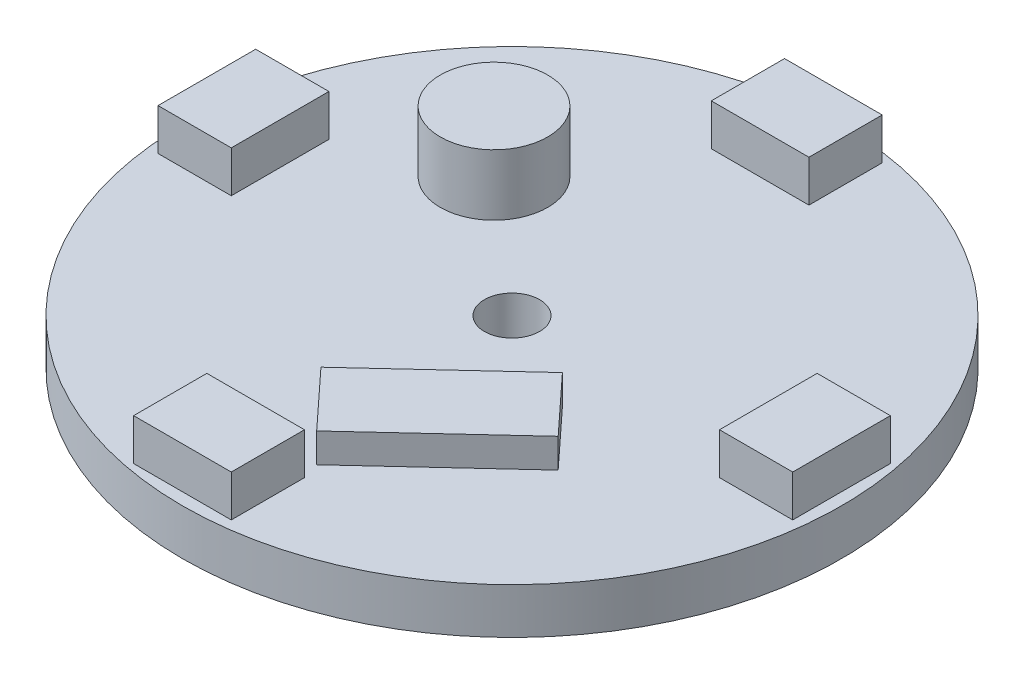
ISO-10303-21;
HEADER;
FILE_DESCRIPTION(('STEP AP214'),'2;1');
FILE_NAME('part.step','',(''),(''),'','','');
FILE_SCHEMA(('AUTOMOTIVE_DESIGN { 1 0 10303 214 1 1 1 1 }'));
ENDSEC;
DATA;
#1=APPLICATION_CONTEXT('core data for automotive mechanical design processes');
#2=APPLICATION_PROTOCOL_DEFINITION('international standard','automotive_design',2000,#1);
#3=PRODUCT_CONTEXT('',#1,'mechanical');
#4=PRODUCT('Part','Part','',(#3));
#5=PRODUCT_RELATED_PRODUCT_CATEGORY('part','',(#4));
#6=PRODUCT_DEFINITION_FORMATION('','',#4);
#7=PRODUCT_DEFINITION_CONTEXT('part definition',#1,'design');
#8=PRODUCT_DEFINITION('design','',#6,#7);
#9=PRODUCT_DEFINITION_SHAPE('','',#8);
#10=(LENGTH_UNIT() NAMED_UNIT(*) SI_UNIT(.MILLI.,.METRE.));
#11=(NAMED_UNIT(*) PLANE_ANGLE_UNIT() SI_UNIT($,.RADIAN.));
#12=(NAMED_UNIT(*) SI_UNIT($,.STERADIAN.) SOLID_ANGLE_UNIT());
#13=UNCERTAINTY_MEASURE_WITH_UNIT(LENGTH_MEASURE(1.E-05),#10,'distance_accuracy_value','');
#14=(GEOMETRIC_REPRESENTATION_CONTEXT(3) GLOBAL_UNCERTAINTY_ASSIGNED_CONTEXT((#13)) GLOBAL_UNIT_ASSIGNED_CONTEXT((#10,
#11,#12)) REPRESENTATION_CONTEXT('',''));
#15=CARTESIAN_POINT('',(0.,0.,0.));
#16=DIRECTION('',(0.,0.,1.));
#17=DIRECTION('',(1.,0.,0.));
#18=AXIS2_PLACEMENT_3D('',#15,#16,#17);
#19=CARTESIAN_POINT('',(-9.27087677780492,2.38125,-8.81791286479938));
#20=DIRECTION('',(0.,1.,0.));
#21=DIRECTION('',(0.,0.,1.));
#22=AXIS2_PLACEMENT_3D('',#19,#20,#21);
#23=PLANE('',#22);
#24=DIRECTION('',(1.,0.,0.));
#25=VECTOR('',#24,1.);
#26=CARTESIAN_POINT('',(-25.7808767778049,2.38125,-6.91291286479939));
#27=LINE('',#26,#25);
#28=CARTESIAN_POINT('',(-25.7808767778049,2.38125,-6.91291286479939));
#29=VERTEX_POINT('',#28);
#30=CARTESIAN_POINT('',(-21.9708767778049,2.38125,-6.91291286479939));
#31=VERTEX_POINT('',#30);
#32=EDGE_CURVE('E200',#29,#31,#27,.T.);
#33=ORIENTED_EDGE('',*,*,#32,.F.);
#34=DIRECTION('',(0.,0.,1.));
#35=VECTOR('',#34,1.);
#36=CARTESIAN_POINT('',(-25.7808767778049,2.38125,-11.9929128647994));
#37=LINE('',#36,#35);
#38=CARTESIAN_POINT('',(-25.7808767778049,2.38125,-11.9929128647994));
#39=VERTEX_POINT('',#38);
#40=EDGE_CURVE('E197',#39,#29,#37,.T.);
#41=ORIENTED_EDGE('',*,*,#40,.F.);
#42=DIRECTION('',(-1.,0.,0.));
#43=VECTOR('',#42,1.);
#44=CARTESIAN_POINT('',(-25.7808767778049,2.38125,-11.9929128647994));
#45=LINE('',#44,#43);
#46=CARTESIAN_POINT('',(-21.9708767778049,2.38125,-11.9929128647994));
#47=VERTEX_POINT('',#46);
#48=EDGE_CURVE('E209',#47,#39,#45,.T.);
#49=ORIENTED_EDGE('',*,*,#48,.F.);
#50=DIRECTION('',(0.,0.,-1.));
#51=VECTOR('',#50,1.);
#52=CARTESIAN_POINT('',(-21.9708767778049,2.38125,-11.9929128647994));
#53=LINE('',#52,#51);
#54=EDGE_CURVE('E217',#31,#47,#53,.T.);
#55=ORIENTED_EDGE('',*,*,#54,.F.);
#56=EDGE_LOOP('',(#33,#41,#49,#55));
#57=FACE_BOUND('',#56,.T.);
#58=DIRECTION('',(1.,0.,0.));
#59=VECTOR('',#58,1.);
#60=CARTESIAN_POINT('',(-11.6027994805209,2.38125,-21.5179128647994));
#61=LINE('',#60,#59);
#62=CARTESIAN_POINT('',(-11.6027994805209,2.38125,-21.5179128647994));
#63=VERTEX_POINT('',#62);
#64=CARTESIAN_POINT('',(-6.52279948052094,2.38125,-21.5179128647994));
#65=VERTEX_POINT('',#64);
#66=EDGE_CURVE('E271',#63,#65,#61,.T.);
#67=ORIENTED_EDGE('',*,*,#66,.F.);
#68=DIRECTION('',(0.,0.,1.));
#69=VECTOR('',#68,1.);
#70=CARTESIAN_POINT('',(-11.6027994805209,2.38125,-25.3279128647994));
#71=LINE('',#70,#69);
#72=CARTESIAN_POINT('',(-11.6027994805209,2.38125,-25.3279128647994));
#73=VERTEX_POINT('',#72);
#74=EDGE_CURVE('E257',#73,#63,#71,.T.);
#75=ORIENTED_EDGE('',*,*,#74,.F.);
#76=DIRECTION('',(-1.,0.,0.));
#77=VECTOR('',#76,1.);
#78=CARTESIAN_POINT('',(-11.6027994805209,2.38125,-25.3279128647994));
#79=LINE('',#78,#77);
#80=CARTESIAN_POINT('',(-6.52279948052094,2.38125,-25.3279128647994));
#81=VERTEX_POINT('',#80);
#82=EDGE_CURVE('E262',#81,#73,#79,.T.);
#83=ORIENTED_EDGE('',*,*,#82,.F.);
#84=DIRECTION('',(0.,0.,-1.));
#85=VECTOR('',#84,1.);
#86=CARTESIAN_POINT('',(-6.52279948052094,2.38125,-25.3279128647994));
#87=LINE('',#86,#85);
#88=EDGE_CURVE('E273',#65,#81,#87,.T.);
#89=ORIENTED_EDGE('',*,*,#88,.F.);
#90=EDGE_LOOP('',(#67,#75,#83,#89));
#91=FACE_BOUND('',#90,.T.);
#92=CARTESIAN_POINT('',(-16.0076279635767,2.38125,-14.6186269123113));
#93=DIRECTION('',(0.,1.,0.));
#94=DIRECTION('',(0.,0.,1.));
#95=AXIS2_PLACEMENT_3D('',#92,#93,#94);
#96=CIRCLE('',#95,2.794);
#97=CARTESIAN_POINT('',(-16.0076279635767,2.38125,-11.8246269123113));
#98=VERTEX_POINT('',#97);
#99=EDGE_CURVE('E314',#98,#98,#96,.T.);
#100=ORIENTED_EDGE('',*,*,#99,.F.);
#101=EDGE_LOOP('',(#100));
#102=FACE_BOUND('',#101,.T.);
#103=CARTESIAN_POINT('',(-9.27087677780492,2.38125,-8.81791286479938));
#104=DIRECTION('',(0.,1.,0.));
#105=DIRECTION('',(0.,0.,1.));
#106=AXIS2_PLACEMENT_3D('',#103,#104,#105);
#107=CIRCLE('',#106,17.145);
#108=CARTESIAN_POINT('',(-9.27087677780492,2.38125,-25.9629128647994));
#109=VERTEX_POINT('',#108);
#110=EDGE_CURVE('E11',#109,#109,#107,.T.);
#111=ORIENTED_EDGE('',*,*,#110,.T.);
#112=EDGE_LOOP('',(#111));
#113=FACE_BOUND('',#112,.T.);
#114=CARTESIAN_POINT('',(-9.27087677780492,2.38125,-8.81791286479938));
#115=DIRECTION('',(0.,1.,0.));
#116=DIRECTION('',(0.,0.,1.));
#117=AXIS2_PLACEMENT_3D('',#114,#115,#116);
#118=CIRCLE('',#117,1.43622908399752);
#119=CARTESIAN_POINT('',(-9.27087677780492,2.38125,-10.2541419487969));
#120=VERTEX_POINT('',#119);
#121=EDGE_CURVE('E321',#120,#120,#118,.T.);
#122=ORIENTED_EDGE('',*,*,#121,.F.);
#123=EDGE_LOOP('',(#122));
#124=FACE_BOUND('',#123,.T.);
#125=DIRECTION('',(0.733904866705104,0.,-0.679252270240272));
#126=VECTOR('',#125,1.);
#127=CARTESIAN_POINT('',(-1.10671318531109,2.38125,-3.05480252081948));
#128=LINE('',#127,#126);
#129=CARTESIAN_POINT('',(-7.63112745031947,2.38125,2.98375016161654));
#130=VERTEX_POINT('',#129);
#131=CARTESIAN_POINT('',(-1.10671318531109,2.38125,-3.05480252081948));
#132=VERTEX_POINT('',#131);
#133=EDGE_CURVE('E298',#130,#132,#128,.T.);
#134=ORIENTED_EDGE('',*,*,#133,.F.);
#135=DIRECTION('',(0.679252270240272,0.,0.733904866705104));
#136=VECTOR('',#135,1.);
#137=CARTESIAN_POINT('',(-7.63112745031947,2.38125,2.98375016161654));
#138=LINE('',#137,#136);
#139=CARTESIAN_POINT('',(-10.3916086765759,2.38125,0.0011607833269936));
#140=VERTEX_POINT('',#139);
#141=EDGE_CURVE('E286',#140,#130,#138,.T.);
#142=ORIENTED_EDGE('',*,*,#141,.F.);
#143=DIRECTION('',(-0.733904866705104,0.,0.679252270240272));
#144=VECTOR('',#143,1.);
#145=CARTESIAN_POINT('',(-10.3916086765759,2.38125,0.0011607833269936));
#146=LINE('',#145,#144);
#147=CARTESIAN_POINT('',(-3.86719441156756,2.38125,-6.03739189910903));
#148=VERTEX_POINT('',#147);
#149=EDGE_CURVE('E290',#148,#140,#146,.T.);
#150=ORIENTED_EDGE('',*,*,#149,.F.);
#151=DIRECTION('',(-0.679252270240272,0.,-0.733904866705104));
#152=VECTOR('',#151,1.);
#153=CARTESIAN_POINT('',(-3.86719441156756,2.38125,-6.03739189910903));
#154=LINE('',#153,#152);
#155=EDGE_CURVE('E300',#132,#148,#154,.T.);
#156=ORIENTED_EDGE('',*,*,#155,.F.);
#157=EDGE_LOOP('',(#134,#142,#150,#156));
#158=FACE_BOUND('',#157,.T.);
#159=DIRECTION('',(1.,0.,0.));
#160=VECTOR('',#159,1.);
#161=CARTESIAN_POINT('',(-12.4458767778049,2.38125,7.69208713520061));
#162=LINE('',#161,#160);
#163=CARTESIAN_POINT('',(-12.4458767778049,2.38125,7.69208713520061));
#164=VERTEX_POINT('',#163);
#165=CARTESIAN_POINT('',(-7.36587677780491,2.38125,7.69208713520061));
#166=VERTEX_POINT('',#165);
#167=EDGE_CURVE('E242',#164,#166,#162,.T.);
#168=ORIENTED_EDGE('',*,*,#167,.F.);
#169=DIRECTION('',(0.,0.,1.));
#170=VECTOR('',#169,1.);
#171=CARTESIAN_POINT('',(-12.4458767778049,2.38125,3.88208713520062));
#172=LINE('',#171,#170);
#173=CARTESIAN_POINT('',(-12.4458767778049,2.38125,3.88208713520062));
#174=VERTEX_POINT('',#173);
#175=EDGE_CURVE('E228',#174,#164,#172,.T.);
#176=ORIENTED_EDGE('',*,*,#175,.F.);
#177=DIRECTION('',(-1.,0.,0.));
#178=VECTOR('',#177,1.);
#179=CARTESIAN_POINT('',(-12.4458767778049,2.38125,3.88208713520062));
#180=LINE('',#179,#178);
#181=CARTESIAN_POINT('',(-7.36587677780491,2.38125,3.88208713520062));
#182=VERTEX_POINT('',#181);
#183=EDGE_CURVE('E233',#182,#174,#180,.T.);
#184=ORIENTED_EDGE('',*,*,#183,.F.);
#185=DIRECTION('',(0.,0.,-1.));
#186=VECTOR('',#185,1.);
#187=CARTESIAN_POINT('',(-7.36587677780491,2.38125,3.88208713520062));
#188=LINE('',#187,#186);
#189=EDGE_CURVE('E244',#166,#182,#188,.T.);
#190=ORIENTED_EDGE('',*,*,#189,.F.);
#191=EDGE_LOOP('',(#168,#176,#184,#190));
#192=FACE_BOUND('',#191,.T.);
#193=DIRECTION('',(1.,0.,0.));
#194=VECTOR('',#193,1.);
#195=CARTESIAN_POINT('',(3.42912322219508,2.38125,-6.91291286479938));
#196=LINE('',#195,#194);
#197=CARTESIAN_POINT('',(3.42912322219508,2.38125,-6.91291286479938));
#198=VERTEX_POINT('',#197);
#199=CARTESIAN_POINT('',(7.23912322219508,2.38125,-6.91291286479938));
#200=VERTEX_POINT('',#199);
#201=EDGE_CURVE('E372',#198,#200,#196,.T.);
#202=ORIENTED_EDGE('',*,*,#201,.F.);
#203=DIRECTION('',(0.,0.,1.));
#204=VECTOR('',#203,1.);
#205=CARTESIAN_POINT('',(3.42912322219508,2.38125,-11.9929128647994));
#206=LINE('',#205,#204);
#207=CARTESIAN_POINT('',(3.42912322219508,2.38125,-11.9929128647994));
#208=VERTEX_POINT('',#207);
#209=EDGE_CURVE('E195',#208,#198,#206,.T.);
#210=ORIENTED_EDGE('',*,*,#209,.F.);
#211=DIRECTION('',(-1.,0.,0.));
#212=VECTOR('',#211,1.);
#213=CARTESIAN_POINT('',(3.42912322219508,2.38125,-11.9929128647994));
#214=LINE('',#213,#212);
#215=CARTESIAN_POINT('',(7.23912322219507,2.38125,-11.9929128647994));
#216=VERTEX_POINT('',#215);
#217=EDGE_CURVE('E191',#216,#208,#214,.T.);
#218=ORIENTED_EDGE('',*,*,#217,.F.);
#219=DIRECTION('',(0.,0.,-1.));
#220=VECTOR('',#219,1.);
#221=CARTESIAN_POINT('',(7.23912322219508,2.38125,-11.9929128647994));
#222=LINE('',#221,#220);
#223=EDGE_CURVE('E374',#200,#216,#222,.T.);
#224=ORIENTED_EDGE('',*,*,#223,.F.);
#225=EDGE_LOOP('',(#202,#210,#218,#224));
#226=FACE_BOUND('',#225,.T.);
#227=ADVANCED_FACE('F34',(#57,#91,#102,#113,#124,#158,#192,#226),#23,.T.);
#228=CARTESIAN_POINT('',(-9.27087677780492,0.,-8.81791286479938));
#229=DIRECTION('',(0.,1.,0.));
#230=DIRECTION('',(0.,0.,1.));
#231=AXIS2_PLACEMENT_3D('',#228,#229,#230);
#232=PLANE('',#231);
#233=CARTESIAN_POINT('',(-9.27087677780492,0.,-8.81791286479938));
#234=DIRECTION('',(0.,1.,0.));
#235=DIRECTION('',(0.,0.,1.));
#236=AXIS2_PLACEMENT_3D('',#233,#234,#235);
#237=CIRCLE('',#236,17.145);
#238=CARTESIAN_POINT('',(-9.27087677780492,0.,-25.9629128647994));
#239=VERTEX_POINT('',#238);
#240=EDGE_CURVE('E38',#239,#239,#237,.T.);
#241=ORIENTED_EDGE('',*,*,#240,.F.);
#242=EDGE_LOOP('',(#241));
#243=FACE_BOUND('',#242,.T.);
#244=CARTESIAN_POINT('',(-9.27087677780492,0.,-8.81791286479938));
#245=DIRECTION('',(0.,1.,0.));
#246=DIRECTION('',(0.,0.,1.));
#247=AXIS2_PLACEMENT_3D('',#244,#245,#246);
#248=CIRCLE('',#247,1.43622908399752);
#249=CARTESIAN_POINT('',(-9.27087677780492,0.,-10.2541419487969));
#250=VERTEX_POINT('',#249);
#251=EDGE_CURVE('E318',#250,#250,#248,.T.);
#252=ORIENTED_EDGE('',*,*,#251,.T.);
#253=EDGE_LOOP('',(#252));
#254=FACE_BOUND('',#253,.T.);
#255=ADVANCED_FACE('F327',(#243,#254),#232,.F.);
#256=CARTESIAN_POINT('',(-9.27087677780492,2.38125,-8.81791286479938));
#257=DIRECTION('',(0.,-1.,0.));
#258=DIRECTION('',(0.,0.,-1.));
#259=AXIS2_PLACEMENT_3D('',#256,#257,#258);
#260=CYLINDRICAL_SURFACE('',#259,17.145);
#261=CARTESIAN_POINT('',(-9.27087677780492,2.38125,-25.9629128647994));
#262=CARTESIAN_POINT('',(-9.27087677780492,2.3564453125,-25.9629128647994));
#263=CARTESIAN_POINT('',(-9.27087677780492,2.331640625,-25.9629128647994));
#264=CARTESIAN_POINT('',(-9.27087677780492,2.28203125,-25.9629128647994));
#265=CARTESIAN_POINT('',(-9.27087677780492,2.2572265625,-25.9629128647994));
#266=CARTESIAN_POINT('',(-9.27087677780492,2.2076171875,-25.9629128647994));
#267=CARTESIAN_POINT('',(-9.27087677780492,2.1828125,-25.9629128647994));
#268=CARTESIAN_POINT('',(-9.27087677780492,2.133203125,-25.9629128647994));
#269=CARTESIAN_POINT('',(-9.27087677780492,2.1083984375,-25.9629128647994));
#270=CARTESIAN_POINT('',(-9.27087677780492,2.0587890625,-25.9629128647994));
#271=CARTESIAN_POINT('',(-9.27087677780492,2.033984375,-25.9629128647994));
#272=CARTESIAN_POINT('',(-9.27087677780492,1.984375,-25.9629128647994));
#273=CARTESIAN_POINT('',(-9.27087677780492,1.9595703125,-25.9629128647994));
#274=CARTESIAN_POINT('',(-9.27087677780492,1.9099609375,-25.9629128647994));
#275=CARTESIAN_POINT('',(-9.27087677780492,1.88515625,-25.9629128647994));
#276=CARTESIAN_POINT('',(-9.27087677780492,1.835546875,-25.9629128647994));
#277=CARTESIAN_POINT('',(-9.27087677780492,1.8107421875,-25.9629128647994));
#278=CARTESIAN_POINT('',(-9.27087677780492,1.7611328125,-25.9629128647994));
#279=CARTESIAN_POINT('',(-9.27087677780492,1.736328125,-25.9629128647994));
#280=CARTESIAN_POINT('',(-9.27087677780492,1.68671875,-25.9629128647994));
#281=CARTESIAN_POINT('',(-9.27087677780492,1.6619140625,-25.9629128647994));
#282=CARTESIAN_POINT('',(-9.27087677780492,1.6123046875,-25.9629128647994));
#283=CARTESIAN_POINT('',(-9.27087677780492,1.5875,-25.9629128647994));
#284=CARTESIAN_POINT('',(-9.27087677780492,1.537890625,-25.9629128647994));
#285=CARTESIAN_POINT('',(-9.27087677780492,1.5130859375,-25.9629128647994));
#286=CARTESIAN_POINT('',(-9.27087677780492,1.4634765625,-25.9629128647994));
#287=CARTESIAN_POINT('',(-9.27087677780492,1.438671875,-25.9629128647994));
#288=CARTESIAN_POINT('',(-9.27087677780492,1.3890625,-25.9629128647994));
#289=CARTESIAN_POINT('',(-9.27087677780492,1.3642578125,-25.9629128647994));
#290=CARTESIAN_POINT('',(-9.27087677780492,1.3146484375,-25.9629128647994));
#291=CARTESIAN_POINT('',(-9.27087677780492,1.28984375,-25.9629128647994));
#292=CARTESIAN_POINT('',(-9.27087677780492,1.240234375,-25.9629128647994));
#293=CARTESIAN_POINT('',(-9.27087677780492,1.2154296875,-25.9629128647994));
#294=CARTESIAN_POINT('',(-9.27087677780492,1.1658203125,-25.9629128647994));
#295=CARTESIAN_POINT('',(-9.27087677780492,1.141015625,-25.9629128647994));
#296=CARTESIAN_POINT('',(-9.27087677780492,1.09140625,-25.9629128647994));
#297=CARTESIAN_POINT('',(-9.27087677780492,1.0666015625,-25.9629128647994));
#298=CARTESIAN_POINT('',(-9.27087677780492,1.0169921875,-25.9629128647994));
#299=CARTESIAN_POINT('',(-9.27087677780492,0.9921875,-25.9629128647994));
#300=CARTESIAN_POINT('',(-9.27087677780492,0.942578125,-25.9629128647994));
#301=CARTESIAN_POINT('',(-9.27087677780492,0.9177734375,-25.9629128647994));
#302=CARTESIAN_POINT('',(-9.27087677780492,0.8681640625,-25.9629128647994));
#303=CARTESIAN_POINT('',(-9.27087677780492,0.843359375,-25.9629128647994));
#304=CARTESIAN_POINT('',(-9.27087677780492,0.79375,-25.9629128647994));
#305=CARTESIAN_POINT('',(-9.27087677780492,0.7689453125,-25.9629128647994));
#306=CARTESIAN_POINT('',(-9.27087677780492,0.7193359375,-25.9629128647994));
#307=CARTESIAN_POINT('',(-9.27087677780492,0.69453125,-25.9629128647994));
#308=CARTESIAN_POINT('',(-9.27087677780492,0.644921875,-25.9629128647994));
#309=CARTESIAN_POINT('',(-9.27087677780492,0.6201171875,-25.9629128647994));
#310=CARTESIAN_POINT('',(-9.27087677780492,0.5705078125,-25.9629128647994));
#311=CARTESIAN_POINT('',(-9.27087677780492,0.545703125,-25.9629128647994));
#312=CARTESIAN_POINT('',(-9.27087677780492,0.49609375,-25.9629128647994));
#313=CARTESIAN_POINT('',(-9.27087677780492,0.4712890625,-25.9629128647994));
#314=CARTESIAN_POINT('',(-9.27087677780492,0.4216796875,-25.9629128647994));
#315=CARTESIAN_POINT('',(-9.27087677780492,0.396875,-25.9629128647994));
#316=CARTESIAN_POINT('',(-9.27087677780492,0.347265625,-25.9629128647994));
#317=CARTESIAN_POINT('',(-9.27087677780492,0.3224609375,-25.9629128647994));
#318=CARTESIAN_POINT('',(-9.27087677780492,0.2728515625,-25.9629128647994));
#319=CARTESIAN_POINT('',(-9.27087677780492,0.248046875,-25.9629128647994));
#320=CARTESIAN_POINT('',(-9.27087677780492,0.1984375,-25.9629128647994));
#321=CARTESIAN_POINT('',(-9.27087677780492,0.1736328125,-25.9629128647994));
#322=CARTESIAN_POINT('',(-9.27087677780492,0.1240234375,-25.9629128647994));
#323=CARTESIAN_POINT('',(-9.27087677780492,0.0992187500000001,-25.9629128647994));
#324=CARTESIAN_POINT('',(-9.27087677780492,0.049609375,-25.9629128647994));
#325=CARTESIAN_POINT('',(-9.27087677780492,0.0248046875,-25.9629128647994));
#326=CARTESIAN_POINT('',(-9.27087677780492,0.,-25.9629128647994));
#327=B_SPLINE_CURVE_WITH_KNOTS('',3,(#261,#262,#263,#264,#265,#266,#267,#268,#269,#270,#271,
#272,#273,#274,#275,#276,#277,#278,#279,#280,#281,#282,#283,#284,#285,#286,#287,#288,#289,#290,
#291,#292,#293,#294,#295,#296,#297,#298,#299,#300,#301,#302,#303,#304,#305,#306,#307,#308,#309,
#310,#311,#312,#313,#314,#315,#316,#317,#318,#319,#320,#321,#322,#323,#324,#325,#326),
.UNSPECIFIED.,.F.,.F.,(4,2,2,2,2,2,2,2,2,2,2,2,2,2,2,2,2,2,2,2,2,2,2,2,2,2,2,2,2,2,2,2,4),(0.,
0.0744140625,0.148828125,0.2232421875,0.29765625,0.3720703125,0.446484375,0.5208984375,
0.5953125,0.6697265625,0.744140625,0.8185546875,0.89296875,0.9673828125,1.041796875,
1.1162109375,1.190625,1.2650390625,1.339453125,1.4138671875,1.48828125,1.5626953125,1.637109375,
1.7115234375,1.7859375,1.8603515625,1.934765625,2.0091796875,2.08359375,2.1580078125,
2.232421875,2.3068359375,2.38125),.UNSPECIFIED.);
#328=EDGE_CURVE('BSEAM36',#109,#239,#327,.T.);
#329=ORIENTED_EDGE('',*,*,#110,.F.);
#330=ORIENTED_EDGE('',*,*,#240,.T.);
#331=ORIENTED_EDGE('',*,*,#328,.T.);
#332=ORIENTED_EDGE('',*,*,#328,.F.);
#333=EDGE_LOOP('',(#329,#331,#330,#332));
#334=FACE_BOUND('',#333,.T.);
#335=ADVANCED_FACE('F36',(#334),#260,.T.);
#336=CARTESIAN_POINT('',(-9.27087677780492,2.38125,-8.81791286479938));
#337=DIRECTION('',(0.,-1.,0.));
#338=DIRECTION('',(0.,0.,-1.));
#339=AXIS2_PLACEMENT_3D('',#336,#337,#338);
#340=CYLINDRICAL_SURFACE('',#339,1.43622908399752);
#341=CARTESIAN_POINT('',(-9.27087677780492,2.38125,-10.2541419487969));
#342=CARTESIAN_POINT('',(-9.27087677780492,2.3564453125,-10.2541419487969));
#343=CARTESIAN_POINT('',(-9.27087677780492,2.331640625,-10.2541419487969));
#344=CARTESIAN_POINT('',(-9.27087677780492,2.28203125,-10.2541419487969));
#345=CARTESIAN_POINT('',(-9.27087677780492,2.2572265625,-10.2541419487969));
#346=CARTESIAN_POINT('',(-9.27087677780492,2.2076171875,-10.2541419487969));
#347=CARTESIAN_POINT('',(-9.27087677780492,2.1828125,-10.2541419487969));
#348=CARTESIAN_POINT('',(-9.27087677780492,2.133203125,-10.2541419487969));
#349=CARTESIAN_POINT('',(-9.27087677780492,2.1083984375,-10.2541419487969));
#350=CARTESIAN_POINT('',(-9.27087677780492,2.0587890625,-10.2541419487969));
#351=CARTESIAN_POINT('',(-9.27087677780492,2.033984375,-10.2541419487969));
#352=CARTESIAN_POINT('',(-9.27087677780492,1.984375,-10.2541419487969));
#353=CARTESIAN_POINT('',(-9.27087677780492,1.9595703125,-10.2541419487969));
#354=CARTESIAN_POINT('',(-9.27087677780492,1.9099609375,-10.2541419487969));
#355=CARTESIAN_POINT('',(-9.27087677780492,1.88515625,-10.2541419487969));
#356=CARTESIAN_POINT('',(-9.27087677780492,1.835546875,-10.2541419487969));
#357=CARTESIAN_POINT('',(-9.27087677780492,1.8107421875,-10.2541419487969));
#358=CARTESIAN_POINT('',(-9.27087677780492,1.7611328125,-10.2541419487969));
#359=CARTESIAN_POINT('',(-9.27087677780492,1.736328125,-10.2541419487969));
#360=CARTESIAN_POINT('',(-9.27087677780492,1.68671875,-10.2541419487969));
#361=CARTESIAN_POINT('',(-9.27087677780492,1.6619140625,-10.2541419487969));
#362=CARTESIAN_POINT('',(-9.27087677780492,1.6123046875,-10.2541419487969));
#363=CARTESIAN_POINT('',(-9.27087677780492,1.5875,-10.2541419487969));
#364=CARTESIAN_POINT('',(-9.27087677780492,1.537890625,-10.2541419487969));
#365=CARTESIAN_POINT('',(-9.27087677780492,1.5130859375,-10.2541419487969));
#366=CARTESIAN_POINT('',(-9.27087677780492,1.4634765625,-10.2541419487969));
#367=CARTESIAN_POINT('',(-9.27087677780492,1.438671875,-10.2541419487969));
#368=CARTESIAN_POINT('',(-9.27087677780492,1.3890625,-10.2541419487969));
#369=CARTESIAN_POINT('',(-9.27087677780492,1.3642578125,-10.2541419487969));
#370=CARTESIAN_POINT('',(-9.27087677780492,1.3146484375,-10.2541419487969));
#371=CARTESIAN_POINT('',(-9.27087677780492,1.28984375,-10.2541419487969));
#372=CARTESIAN_POINT('',(-9.27087677780492,1.240234375,-10.2541419487969));
#373=CARTESIAN_POINT('',(-9.27087677780492,1.2154296875,-10.2541419487969));
#374=CARTESIAN_POINT('',(-9.27087677780492,1.1658203125,-10.2541419487969));
#375=CARTESIAN_POINT('',(-9.27087677780492,1.141015625,-10.2541419487969));
#376=CARTESIAN_POINT('',(-9.27087677780492,1.09140625,-10.2541419487969));
#377=CARTESIAN_POINT('',(-9.27087677780492,1.0666015625,-10.2541419487969));
#378=CARTESIAN_POINT('',(-9.27087677780492,1.0169921875,-10.2541419487969));
#379=CARTESIAN_POINT('',(-9.27087677780492,0.9921875,-10.2541419487969));
#380=CARTESIAN_POINT('',(-9.27087677780492,0.942578125,-10.2541419487969));
#381=CARTESIAN_POINT('',(-9.27087677780492,0.9177734375,-10.2541419487969));
#382=CARTESIAN_POINT('',(-9.27087677780492,0.8681640625,-10.2541419487969));
#383=CARTESIAN_POINT('',(-9.27087677780492,0.843359375,-10.2541419487969));
#384=CARTESIAN_POINT('',(-9.27087677780492,0.79375,-10.2541419487969));
#385=CARTESIAN_POINT('',(-9.27087677780492,0.7689453125,-10.2541419487969));
#386=CARTESIAN_POINT('',(-9.27087677780492,0.7193359375,-10.2541419487969));
#387=CARTESIAN_POINT('',(-9.27087677780492,0.69453125,-10.2541419487969));
#388=CARTESIAN_POINT('',(-9.27087677780492,0.644921875,-10.2541419487969));
#389=CARTESIAN_POINT('',(-9.27087677780492,0.6201171875,-10.2541419487969));
#390=CARTESIAN_POINT('',(-9.27087677780492,0.5705078125,-10.2541419487969));
#391=CARTESIAN_POINT('',(-9.27087677780492,0.545703125,-10.2541419487969));
#392=CARTESIAN_POINT('',(-9.27087677780492,0.49609375,-10.2541419487969));
#393=CARTESIAN_POINT('',(-9.27087677780492,0.4712890625,-10.2541419487969));
#394=CARTESIAN_POINT('',(-9.27087677780492,0.4216796875,-10.2541419487969));
#395=CARTESIAN_POINT('',(-9.27087677780492,0.396875,-10.2541419487969));
#396=CARTESIAN_POINT('',(-9.27087677780492,0.347265625,-10.2541419487969));
#397=CARTESIAN_POINT('',(-9.27087677780492,0.3224609375,-10.2541419487969));
#398=CARTESIAN_POINT('',(-9.27087677780492,0.2728515625,-10.2541419487969));
#399=CARTESIAN_POINT('',(-9.27087677780492,0.248046875,-10.2541419487969));
#400=CARTESIAN_POINT('',(-9.27087677780492,0.1984375,-10.2541419487969));
#401=CARTESIAN_POINT('',(-9.27087677780492,0.1736328125,-10.2541419487969));
#402=CARTESIAN_POINT('',(-9.27087677780492,0.1240234375,-10.2541419487969));
#403=CARTESIAN_POINT('',(-9.27087677780492,0.0992187500000001,-10.2541419487969));
#404=CARTESIAN_POINT('',(-9.27087677780492,0.049609375,-10.2541419487969));
#405=CARTESIAN_POINT('',(-9.27087677780492,0.0248046875,-10.2541419487969));
#406=CARTESIAN_POINT('',(-9.27087677780492,0.,-10.2541419487969));
#407=B_SPLINE_CURVE_WITH_KNOTS('',3,(#341,#342,#343,#344,#345,#346,#347,#348,#349,#350,#351,
#352,#353,#354,#355,#356,#357,#358,#359,#360,#361,#362,#363,#364,#365,#366,#367,#368,#369,#370,
#371,#372,#373,#374,#375,#376,#377,#378,#379,#380,#381,#382,#383,#384,#385,#386,#387,#388,#389,
#390,#391,#392,#393,#394,#395,#396,#397,#398,#399,#400,#401,#402,#403,#404,#405,#406),
.UNSPECIFIED.,.F.,.F.,(4,2,2,2,2,2,2,2,2,2,2,2,2,2,2,2,2,2,2,2,2,2,2,2,2,2,2,2,2,2,2,2,4),(0.,
0.0744140624999996,0.148828125,0.2232421875,0.29765625,0.3720703125,0.446484375,0.5208984375,
0.5953125,0.6697265625,0.744140625,0.8185546875,0.89296875,0.9673828125,1.041796875,
1.1162109375,1.190625,1.2650390625,1.339453125,1.4138671875,1.48828125,1.5626953125,1.637109375,
1.7115234375,1.7859375,1.8603515625,1.934765625,2.0091796875,2.08359375,2.1580078125,
2.232421875,2.3068359375,2.38125),.UNSPECIFIED.);
#408=EDGE_CURVE('BSEAM329',#120,#250,#407,.T.);
#409=ORIENTED_EDGE('',*,*,#121,.T.);
#410=ORIENTED_EDGE('',*,*,#251,.F.);
#411=ORIENTED_EDGE('',*,*,#408,.T.);
#412=ORIENTED_EDGE('',*,*,#408,.F.);
#413=EDGE_LOOP('',(#409,#411,#410,#412));
#414=FACE_BOUND('',#413,.T.);
#415=ADVANCED_FACE('F329',(#414),#340,.F.);
#416=CARTESIAN_POINT('',(-16.0076279635767,5.55625,-14.6186269123113));
#417=DIRECTION('',(0.,-1.,0.));
#418=DIRECTION('',(0.,0.,-1.));
#419=AXIS2_PLACEMENT_3D('',#416,#417,#418);
#420=CYLINDRICAL_SURFACE('',#419,2.794);
#421=CARTESIAN_POINT('',(-16.0076279635767,5.55625,-14.6186269123113));
#422=DIRECTION('',(0.,1.,0.));
#423=DIRECTION('',(0.,0.,1.));
#424=AXIS2_PLACEMENT_3D('',#421,#422,#423);
#425=CIRCLE('',#424,2.794);
#426=CARTESIAN_POINT('',(-16.0076279635767,5.55625,-11.8246269123113));
#427=VERTEX_POINT('',#426);
#428=EDGE_CURVE('E315',#427,#427,#425,.T.);
#429=ORIENTED_EDGE('',*,*,#428,.F.);
#430=EDGE_LOOP('',(#429));
#431=FACE_BOUND('',#430,.T.);
#432=ORIENTED_EDGE('',*,*,#99,.T.);
#433=EDGE_LOOP('',(#432));
#434=FACE_BOUND('',#433,.T.);
#435=ADVANCED_FACE('F331',(#431,#434),#420,.T.);
#436=CARTESIAN_POINT('',(-16.0076279635767,5.55625,-14.6186269123113));
#437=DIRECTION('',(0.,1.,0.));
#438=DIRECTION('',(0.,0.,1.));
#439=AXIS2_PLACEMENT_3D('',#436,#437,#438);
#440=PLANE('',#439);
#441=ORIENTED_EDGE('',*,*,#428,.T.);
#442=EDGE_LOOP('',(#441));
#443=FACE_BOUND('',#442,.T.);
#444=ADVANCED_FACE('F338',(#443),#440,.T.);
#445=CARTESIAN_POINT('',(-7.63112745031947,3.90525,2.98375016161654));
#446=DIRECTION('',(0.733904866705104,0.,-0.679252270240272));
#447=DIRECTION('',(-0.679252270240272,0.,-0.733904866705104));
#448=AXIS2_PLACEMENT_3D('',#445,#446,#447);
#449=PLANE('',#448);
#450=ORIENTED_EDGE('',*,*,#141,.T.);
#451=DIRECTION('',(0.,-1.,0.));
#452=VECTOR('',#451,1.);
#453=CARTESIAN_POINT('',(-7.63112745031947,3.90525,2.98375016161654));
#454=LINE('',#453,#452);
#455=CARTESIAN_POINT('',(-7.63112745031947,3.90525,2.98375016161654));
#456=VERTEX_POINT('',#455);
#457=EDGE_CURVE('E311',#456,#130,#454,.T.);
#458=ORIENTED_EDGE('',*,*,#457,.F.);
#459=DIRECTION('',(0.679252270240272,0.,0.733904866705104));
#460=VECTOR('',#459,1.);
#461=CARTESIAN_POINT('',(-10.0465485232939,3.90525,0.373984455613187));
#462=LINE('',#461,#460);
#463=CARTESIAN_POINT('',(-10.3916086765759,3.90525,0.0011607833269936));
#464=VERTEX_POINT('',#463);
#465=EDGE_CURVE('E287',#464,#456,#462,.T.);
#466=ORIENTED_EDGE('',*,*,#465,.F.);
#467=DIRECTION('',(0.,-1.,0.));
#468=VECTOR('',#467,1.);
#469=CARTESIAN_POINT('',(-10.3916086765759,3.90525,0.0011607833269936));
#470=LINE('',#469,#468);
#471=EDGE_CURVE('E296',#464,#140,#470,.T.);
#472=ORIENTED_EDGE('',*,*,#471,.T.);
#473=EDGE_LOOP('',(#450,#458,#466,#472));
#474=FACE_BOUND('',#473,.T.);
#475=ADVANCED_FACE('F473',(#474),#449,.F.);
#476=CARTESIAN_POINT('',(-1.10671318531109,3.90525,-3.05480252081948));
#477=DIRECTION('',(-0.679252270240272,0.,-0.733904866705104));
#478=DIRECTION('',(-0.733904866705104,0.,0.679252270240272));
#479=AXIS2_PLACEMENT_3D('',#476,#477,#478);
#480=PLANE('',#479);
#481=ORIENTED_EDGE('',*,*,#133,.T.);
#482=DIRECTION('',(0.,-1.,0.));
#483=VECTOR('',#482,1.);
#484=CARTESIAN_POINT('',(-1.10671318531109,3.90525,-3.05480252081948));
#485=LINE('',#484,#483);
#486=CARTESIAN_POINT('',(-1.10671318531109,3.90525,-3.05480252081948));
#487=VERTEX_POINT('',#486);
#488=EDGE_CURVE('E308',#487,#132,#485,.T.);
#489=ORIENTED_EDGE('',*,*,#488,.F.);
#490=DIRECTION('',(0.733904866705104,0.,-0.679252270240272));
#491=VECTOR('',#490,1.);
#492=CARTESIAN_POINT('',(-1.10671318531109,3.90525,-3.05480252081948));
#493=LINE('',#492,#491);
#494=EDGE_CURVE('E289',#456,#487,#493,.T.);
#495=ORIENTED_EDGE('',*,*,#494,.F.);
#496=ORIENTED_EDGE('',*,*,#457,.T.);
#497=EDGE_LOOP('',(#481,#489,#495,#496));
#498=FACE_BOUND('',#497,.T.);
#499=ADVANCED_FACE('F469',(#498),#480,.F.);
#500=CARTESIAN_POINT('',(-3.86719441156756,3.90525,-6.03739189910903));
#501=DIRECTION('',(-0.733904866705104,0.,0.679252270240272));
#502=DIRECTION('',(0.679252270240272,0.,0.733904866705104));
#503=AXIS2_PLACEMENT_3D('',#500,#501,#502);
#504=PLANE('',#503);
#505=ORIENTED_EDGE('',*,*,#155,.T.);
#506=DIRECTION('',(0.,-1.,0.));
#507=VECTOR('',#506,1.);
#508=CARTESIAN_POINT('',(-3.86719441156756,3.90525,-6.03739189910903));
#509=LINE('',#508,#507);
#510=CARTESIAN_POINT('',(-3.86719441156756,3.90525,-6.03739189910903));
#511=VERTEX_POINT('',#510);
#512=EDGE_CURVE('E306',#511,#148,#509,.T.);
#513=ORIENTED_EDGE('',*,*,#512,.F.);
#514=DIRECTION('',(-0.679252270240272,0.,-0.733904866705104));
#515=VECTOR('',#514,1.);
#516=CARTESIAN_POINT('',(-3.86719441156756,3.90525,-6.03739189910903));
#517=LINE('',#516,#515);
#518=EDGE_CURVE('E292',#487,#511,#517,.T.);
#519=ORIENTED_EDGE('',*,*,#518,.F.);
#520=ORIENTED_EDGE('',*,*,#488,.T.);
#521=EDGE_LOOP('',(#505,#513,#519,#520));
#522=FACE_BOUND('',#521,.T.);
#523=ADVANCED_FACE('F465',(#522),#504,.F.);
#524=CARTESIAN_POINT('',(-10.3916086765759,3.90525,0.0011607833269936));
#525=DIRECTION('',(0.679252270240272,0.,0.733904866705104));
#526=DIRECTION('',(0.733904866705104,0.,-0.679252270240272));
#527=AXIS2_PLACEMENT_3D('',#524,#525,#526);
#528=PLANE('',#527);
#529=ORIENTED_EDGE('',*,*,#149,.T.);
#530=ORIENTED_EDGE('',*,*,#471,.F.);
#531=DIRECTION('',(-0.733904866705104,0.,0.679252270240272));
#532=VECTOR('',#531,1.);
#533=CARTESIAN_POINT('',(-10.3916086765759,3.90525,0.0011607833269936));
#534=LINE('',#533,#532);
#535=EDGE_CURVE('E294',#511,#464,#534,.T.);
#536=ORIENTED_EDGE('',*,*,#535,.F.);
#537=ORIENTED_EDGE('',*,*,#512,.T.);
#538=EDGE_LOOP('',(#529,#530,#536,#537));
#539=FACE_BOUND('',#538,.T.);
#540=ADVANCED_FACE('F461',(#539),#528,.F.);
#541=CARTESIAN_POINT('',(0.,3.90525,0.));
#542=DIRECTION('',(0.,-1.,0.));
#543=DIRECTION('',(0.,0.,-1.));
#544=AXIS2_PLACEMENT_3D('',#541,#542,#543);
#545=PLANE('',#544);
#546=ORIENTED_EDGE('',*,*,#465,.T.);
#547=ORIENTED_EDGE('',*,*,#494,.T.);
#548=ORIENTED_EDGE('',*,*,#518,.T.);
#549=ORIENTED_EDGE('',*,*,#535,.T.);
#550=EDGE_LOOP('',(#546,#547,#548,#549));
#551=FACE_BOUND('',#550,.T.);
#552=ADVANCED_FACE('F457',(#551),#545,.F.);
#553=CARTESIAN_POINT('',(-11.6027994805209,4.54025,-25.3279128647994));
#554=DIRECTION('',(1.,0.,0.));
#555=DIRECTION('',(0.,0.,-1.));
#556=AXIS2_PLACEMENT_3D('',#553,#554,#555);
#557=PLANE('',#556);
#558=ORIENTED_EDGE('',*,*,#74,.T.);
#559=DIRECTION('',(0.,-1.,0.));
#560=VECTOR('',#559,1.);
#561=CARTESIAN_POINT('',(-11.6027994805209,4.54025,-21.5179128647994));
#562=LINE('',#561,#560);
#563=CARTESIAN_POINT('',(-11.6027994805209,4.54025,-21.5179128647994));
#564=VERTEX_POINT('',#563);
#565=EDGE_CURVE('E284',#564,#63,#562,.T.);
#566=ORIENTED_EDGE('',*,*,#565,.F.);
#567=DIRECTION('',(0.,0.,1.));
#568=VECTOR('',#567,1.);
#569=CARTESIAN_POINT('',(-11.6027994805209,4.54025,-25.3279128647994));
#570=LINE('',#569,#568);
#571=CARTESIAN_POINT('',(-11.6027994805209,4.54025,-25.3279128647994));
#572=VERTEX_POINT('',#571);
#573=EDGE_CURVE('E258',#572,#564,#570,.T.);
#574=ORIENTED_EDGE('',*,*,#573,.F.);
#575=DIRECTION('',(0.,-1.,0.));
#576=VECTOR('',#575,1.);
#577=CARTESIAN_POINT('',(-11.6027994805209,4.54025,-25.3279128647994));
#578=LINE('',#577,#576);
#579=EDGE_CURVE('E268',#572,#73,#578,.T.);
#580=ORIENTED_EDGE('',*,*,#579,.T.);
#581=EDGE_LOOP('',(#558,#566,#574,#580));
#582=FACE_BOUND('',#581,.T.);
#583=ADVANCED_FACE('F453',(#582),#557,.F.);
#584=CARTESIAN_POINT('',(-11.6027994805209,4.54025,-21.5179128647994));
#585=DIRECTION('',(0.,0.,-1.));
#586=DIRECTION('',(-1.,0.,0.));
#587=AXIS2_PLACEMENT_3D('',#584,#585,#586);
#588=PLANE('',#587);
#589=ORIENTED_EDGE('',*,*,#66,.T.);
#590=DIRECTION('',(0.,-1.,0.));
#591=VECTOR('',#590,1.);
#592=CARTESIAN_POINT('',(-6.52279948052094,4.54025,-21.5179128647994));
#593=LINE('',#592,#591);
#594=CARTESIAN_POINT('',(-6.52279948052094,4.54025,-21.5179128647994));
#595=VERTEX_POINT('',#594);
#596=EDGE_CURVE('E281',#595,#65,#593,.T.);
#597=ORIENTED_EDGE('',*,*,#596,.F.);
#598=DIRECTION('',(1.,0.,0.));
#599=VECTOR('',#598,1.);
#600=CARTESIAN_POINT('',(-11.6027994805209,4.54025,-21.5179128647994));
#601=LINE('',#600,#599);
#602=EDGE_CURVE('E261',#564,#595,#601,.T.);
#603=ORIENTED_EDGE('',*,*,#602,.F.);
#604=ORIENTED_EDGE('',*,*,#565,.T.);
#605=EDGE_LOOP('',(#589,#597,#603,#604));
#606=FACE_BOUND('',#605,.T.);
#607=ADVANCED_FACE('F449',(#606),#588,.F.);
#608=CARTESIAN_POINT('',(-6.52279948052094,4.54025,-25.3279128647994));
#609=DIRECTION('',(-1.,0.,0.));
#610=DIRECTION('',(0.,0.,1.));
#611=AXIS2_PLACEMENT_3D('',#608,#609,#610);
#612=PLANE('',#611);
#613=ORIENTED_EDGE('',*,*,#88,.T.);
#614=DIRECTION('',(0.,-1.,0.));
#615=VECTOR('',#614,1.);
#616=CARTESIAN_POINT('',(-6.52279948052094,4.54025,-25.3279128647994));
#617=LINE('',#616,#615);
#618=CARTESIAN_POINT('',(-6.52279948052094,4.54025,-25.3279128647994));
#619=VERTEX_POINT('',#618);
#620=EDGE_CURVE('E279',#619,#81,#617,.T.);
#621=ORIENTED_EDGE('',*,*,#620,.F.);
#622=DIRECTION('',(0.,0.,-1.));
#623=VECTOR('',#622,1.);
#624=CARTESIAN_POINT('',(-6.52279948052094,4.54025,-25.3279128647994));
#625=LINE('',#624,#623);
#626=EDGE_CURVE('E264',#595,#619,#625,.T.);
#627=ORIENTED_EDGE('',*,*,#626,.F.);
#628=ORIENTED_EDGE('',*,*,#596,.T.);
#629=EDGE_LOOP('',(#613,#621,#627,#628));
#630=FACE_BOUND('',#629,.T.);
#631=ADVANCED_FACE('F445',(#630),#612,.F.);
#632=CARTESIAN_POINT('',(-11.6027994805209,4.54025,-25.3279128647994));
#633=DIRECTION('',(0.,0.,1.));
#634=DIRECTION('',(1.,0.,0.));
#635=AXIS2_PLACEMENT_3D('',#632,#633,#634);
#636=PLANE('',#635);
#637=ORIENTED_EDGE('',*,*,#82,.T.);
#638=ORIENTED_EDGE('',*,*,#579,.F.);
#639=DIRECTION('',(-1.,0.,0.));
#640=VECTOR('',#639,1.);
#641=CARTESIAN_POINT('',(-11.6027994805209,4.54025,-25.3279128647994));
#642=LINE('',#641,#640);
#643=EDGE_CURVE('E266',#619,#572,#642,.T.);
#644=ORIENTED_EDGE('',*,*,#643,.F.);
#645=ORIENTED_EDGE('',*,*,#620,.T.);
#646=EDGE_LOOP('',(#637,#638,#644,#645));
#647=FACE_BOUND('',#646,.T.);
#648=ADVANCED_FACE('F441',(#647),#636,.F.);
#649=CARTESIAN_POINT('',(0.,4.54025,0.));
#650=DIRECTION('',(0.,1.,0.));
#651=DIRECTION('',(0.,0.,1.));
#652=AXIS2_PLACEMENT_3D('',#649,#650,#651);
#653=PLANE('',#652);
#654=ORIENTED_EDGE('',*,*,#573,.T.);
#655=ORIENTED_EDGE('',*,*,#602,.T.);
#656=ORIENTED_EDGE('',*,*,#626,.T.);
#657=ORIENTED_EDGE('',*,*,#643,.T.);
#658=EDGE_LOOP('',(#654,#655,#656,#657));
#659=FACE_BOUND('',#658,.T.);
#660=ADVANCED_FACE('F437',(#659),#653,.T.);
#661=CARTESIAN_POINT('',(-12.4458767778049,4.54025,3.88208713520062));
#662=DIRECTION('',(1.,0.,0.));
#663=DIRECTION('',(0.,0.,-1.));
#664=AXIS2_PLACEMENT_3D('',#661,#662,#663);
#665=PLANE('',#664);
#666=ORIENTED_EDGE('',*,*,#175,.T.);
#667=DIRECTION('',(0.,-1.,0.));
#668=VECTOR('',#667,1.);
#669=CARTESIAN_POINT('',(-12.4458767778049,4.54025,7.69208713520061));
#670=LINE('',#669,#668);
#671=CARTESIAN_POINT('',(-12.4458767778049,4.54025,7.69208713520061));
#672=VERTEX_POINT('',#671);
#673=EDGE_CURVE('E255',#672,#164,#670,.T.);
#674=ORIENTED_EDGE('',*,*,#673,.F.);
#675=DIRECTION('',(0.,0.,1.));
#676=VECTOR('',#675,1.);
#677=CARTESIAN_POINT('',(-12.4458767778049,4.54025,3.88208713520062));
#678=LINE('',#677,#676);
#679=CARTESIAN_POINT('',(-12.4458767778049,4.54025,3.88208713520062));
#680=VERTEX_POINT('',#679);
#681=EDGE_CURVE('E229',#680,#672,#678,.T.);
#682=ORIENTED_EDGE('',*,*,#681,.F.);
#683=DIRECTION('',(0.,-1.,0.));
#684=VECTOR('',#683,1.);
#685=CARTESIAN_POINT('',(-12.4458767778049,4.54025,3.88208713520062));
#686=LINE('',#685,#684);
#687=EDGE_CURVE('E239',#680,#174,#686,.T.);
#688=ORIENTED_EDGE('',*,*,#687,.T.);
#689=EDGE_LOOP('',(#666,#674,#682,#688));
#690=FACE_BOUND('',#689,.T.);
#691=ADVANCED_FACE('F433',(#690),#665,.F.);
#692=CARTESIAN_POINT('',(-12.4458767778049,4.54025,7.69208713520061));
#693=DIRECTION('',(0.,0.,-1.));
#694=DIRECTION('',(-1.,0.,0.));
#695=AXIS2_PLACEMENT_3D('',#692,#693,#694);
#696=PLANE('',#695);
#697=ORIENTED_EDGE('',*,*,#167,.T.);
#698=DIRECTION('',(0.,-1.,0.));
#699=VECTOR('',#698,1.);
#700=CARTESIAN_POINT('',(-7.36587677780491,4.54025,7.69208713520061));
#701=LINE('',#700,#699);
#702=CARTESIAN_POINT('',(-7.36587677780491,4.54025,7.69208713520061));
#703=VERTEX_POINT('',#702);
#704=EDGE_CURVE('E252',#703,#166,#701,.T.);
#705=ORIENTED_EDGE('',*,*,#704,.F.);
#706=DIRECTION('',(1.,0.,0.));
#707=VECTOR('',#706,1.);
#708=CARTESIAN_POINT('',(-12.4458767778049,4.54025,7.69208713520061));
#709=LINE('',#708,#707);
#710=EDGE_CURVE('E232',#672,#703,#709,.T.);
#711=ORIENTED_EDGE('',*,*,#710,.F.);
#712=ORIENTED_EDGE('',*,*,#673,.T.);
#713=EDGE_LOOP('',(#697,#705,#711,#712));
#714=FACE_BOUND('',#713,.T.);
#715=ADVANCED_FACE('F429',(#714),#696,.F.);
#716=CARTESIAN_POINT('',(-7.36587677780491,4.54025,3.88208713520062));
#717=DIRECTION('',(-1.,0.,0.));
#718=DIRECTION('',(0.,0.,1.));
#719=AXIS2_PLACEMENT_3D('',#716,#717,#718);
#720=PLANE('',#719);
#721=ORIENTED_EDGE('',*,*,#189,.T.);
#722=DIRECTION('',(0.,-1.,0.));
#723=VECTOR('',#722,1.);
#724=CARTESIAN_POINT('',(-7.36587677780491,4.54025,3.88208713520062));
#725=LINE('',#724,#723);
#726=CARTESIAN_POINT('',(-7.36587677780491,4.54025,3.88208713520062));
#727=VERTEX_POINT('',#726);
#728=EDGE_CURVE('E250',#727,#182,#725,.T.);
#729=ORIENTED_EDGE('',*,*,#728,.F.);
#730=DIRECTION('',(0.,0.,-1.));
#731=VECTOR('',#730,1.);
#732=CARTESIAN_POINT('',(-7.36587677780491,4.54025,3.88208713520062));
#733=LINE('',#732,#731);
#734=EDGE_CURVE('E235',#703,#727,#733,.T.);
#735=ORIENTED_EDGE('',*,*,#734,.F.);
#736=ORIENTED_EDGE('',*,*,#704,.T.);
#737=EDGE_LOOP('',(#721,#729,#735,#736));
#738=FACE_BOUND('',#737,.T.);
#739=ADVANCED_FACE('F425',(#738),#720,.F.);
#740=CARTESIAN_POINT('',(-12.4458767778049,4.54025,3.88208713520062));
#741=DIRECTION('',(0.,0.,1.));
#742=DIRECTION('',(1.,0.,0.));
#743=AXIS2_PLACEMENT_3D('',#740,#741,#742);
#744=PLANE('',#743);
#745=ORIENTED_EDGE('',*,*,#183,.T.);
#746=ORIENTED_EDGE('',*,*,#687,.F.);
#747=DIRECTION('',(-1.,0.,0.));
#748=VECTOR('',#747,1.);
#749=CARTESIAN_POINT('',(-12.4458767778049,4.54025,3.88208713520062));
#750=LINE('',#749,#748);
#751=EDGE_CURVE('E237',#727,#680,#750,.T.);
#752=ORIENTED_EDGE('',*,*,#751,.F.);
#753=ORIENTED_EDGE('',*,*,#728,.T.);
#754=EDGE_LOOP('',(#745,#746,#752,#753));
#755=FACE_BOUND('',#754,.T.);
#756=ADVANCED_FACE('F421',(#755),#744,.F.);
#757=CARTESIAN_POINT('',(0.,4.54025,0.));
#758=DIRECTION('',(0.,1.,0.));
#759=DIRECTION('',(0.,0.,1.));
#760=AXIS2_PLACEMENT_3D('',#757,#758,#759);
#761=PLANE('',#760);
#762=ORIENTED_EDGE('',*,*,#681,.T.);
#763=ORIENTED_EDGE('',*,*,#710,.T.);
#764=ORIENTED_EDGE('',*,*,#734,.T.);
#765=ORIENTED_EDGE('',*,*,#751,.T.);
#766=EDGE_LOOP('',(#762,#763,#764,#765));
#767=FACE_BOUND('',#766,.T.);
#768=ADVANCED_FACE('F417',(#767),#761,.T.);
#769=CARTESIAN_POINT('',(-25.7808767778049,4.54025,-11.9929128647994));
#770=DIRECTION('',(1.,0.,0.));
#771=DIRECTION('',(0.,0.,-1.));
#772=AXIS2_PLACEMENT_3D('',#769,#770,#771);
#773=PLANE('',#772);
#774=ORIENTED_EDGE('',*,*,#40,.T.);
#775=DIRECTION('',(0.,-1.,0.));
#776=VECTOR('',#775,1.);
#777=CARTESIAN_POINT('',(-25.7808767778049,4.54025,-6.91291286479939));
#778=LINE('',#777,#776);
#779=CARTESIAN_POINT('',(-25.7808767778049,4.54025,-6.91291286479939));
#780=VERTEX_POINT('',#779);
#781=EDGE_CURVE('E226',#780,#29,#778,.T.);
#782=ORIENTED_EDGE('',*,*,#781,.F.);
#783=DIRECTION('',(0.,0.,1.));
#784=VECTOR('',#783,1.);
#785=CARTESIAN_POINT('',(-25.7808767778049,4.54025,-11.9929128647994));
#786=LINE('',#785,#784);
#787=CARTESIAN_POINT('',(-25.7808767778049,4.54025,-11.9929128647994));
#788=VERTEX_POINT('',#787);
#789=EDGE_CURVE('E205',#788,#780,#786,.T.);
#790=ORIENTED_EDGE('',*,*,#789,.F.);
#791=DIRECTION('',(0.,-1.,0.));
#792=VECTOR('',#791,1.);
#793=CARTESIAN_POINT('',(-25.7808767778049,4.54025,-11.9929128647994));
#794=LINE('',#793,#792);
#795=EDGE_CURVE('E214',#788,#39,#794,.T.);
#796=ORIENTED_EDGE('',*,*,#795,.T.);
#797=EDGE_LOOP('',(#774,#782,#790,#796));
#798=FACE_BOUND('',#797,.T.);
#799=ADVANCED_FACE('F413',(#798),#773,.F.);
#800=CARTESIAN_POINT('',(-25.7808767778049,4.54025,-6.91291286479939));
#801=DIRECTION('',(0.,0.,-1.));
#802=DIRECTION('',(-1.,0.,0.));
#803=AXIS2_PLACEMENT_3D('',#800,#801,#802);
#804=PLANE('',#803);
#805=ORIENTED_EDGE('',*,*,#32,.T.);
#806=DIRECTION('',(0.,-1.,0.));
#807=VECTOR('',#806,1.);
#808=CARTESIAN_POINT('',(-21.9708767778049,4.54025,-6.91291286479939));
#809=LINE('',#808,#807);
#810=CARTESIAN_POINT('',(-21.9708767778049,4.54025,-6.91291286479939));
#811=VERTEX_POINT('',#810);
#812=EDGE_CURVE('E223',#811,#31,#809,.T.);
#813=ORIENTED_EDGE('',*,*,#812,.F.);
#814=DIRECTION('',(1.,0.,0.));
#815=VECTOR('',#814,1.);
#816=CARTESIAN_POINT('',(-25.7808767778049,4.54025,-6.91291286479939));
#817=LINE('',#816,#815);
#818=EDGE_CURVE('E208',#780,#811,#817,.T.);
#819=ORIENTED_EDGE('',*,*,#818,.F.);
#820=ORIENTED_EDGE('',*,*,#781,.T.);
#821=EDGE_LOOP('',(#805,#813,#819,#820));
#822=FACE_BOUND('',#821,.T.);
#823=ADVANCED_FACE('F409',(#822),#804,.F.);
#824=CARTESIAN_POINT('',(-21.9708767778049,4.54025,-11.9929128647994));
#825=DIRECTION('',(-1.,0.,0.));
#826=DIRECTION('',(0.,0.,1.));
#827=AXIS2_PLACEMENT_3D('',#824,#825,#826);
#828=PLANE('',#827);
#829=ORIENTED_EDGE('',*,*,#54,.T.);
#830=DIRECTION('',(0.,-1.,0.));
#831=VECTOR('',#830,1.);
#832=CARTESIAN_POINT('',(-21.9708767778049,4.54025,-11.9929128647994));
#833=LINE('',#832,#831);
#834=CARTESIAN_POINT('',(-21.9708767778049,4.54025,-11.9929128647994));
#835=VERTEX_POINT('',#834);
#836=EDGE_CURVE('E57',#835,#47,#833,.T.);
#837=ORIENTED_EDGE('',*,*,#836,.F.);
#838=DIRECTION('',(0.,0.,-1.));
#839=VECTOR('',#838,1.);
#840=CARTESIAN_POINT('',(-21.9708767778049,4.54025,-11.9929128647994));
#841=LINE('',#840,#839);
#842=EDGE_CURVE('E211',#811,#835,#841,.T.);
#843=ORIENTED_EDGE('',*,*,#842,.F.);
#844=ORIENTED_EDGE('',*,*,#812,.T.);
#845=EDGE_LOOP('',(#829,#837,#843,#844));
#846=FACE_BOUND('',#845,.T.);
#847=ADVANCED_FACE('F406',(#846),#828,.F.);
#848=CARTESIAN_POINT('',(-25.7808767778049,4.54025,-11.9929128647994));
#849=DIRECTION('',(0.,0.,1.));
#850=DIRECTION('',(1.,0.,0.));
#851=AXIS2_PLACEMENT_3D('',#848,#849,#850);
#852=PLANE('',#851);
#853=ORIENTED_EDGE('',*,*,#48,.T.);
#854=ORIENTED_EDGE('',*,*,#795,.F.);
#855=DIRECTION('',(-1.,0.,0.));
#856=VECTOR('',#855,1.);
#857=CARTESIAN_POINT('',(-25.7808767778049,4.54025,-11.9929128647994));
#858=LINE('',#857,#856);
#859=EDGE_CURVE('E213',#835,#788,#858,.T.);
#860=ORIENTED_EDGE('',*,*,#859,.F.);
#861=ORIENTED_EDGE('',*,*,#836,.T.);
#862=EDGE_LOOP('',(#853,#854,#860,#861));
#863=FACE_BOUND('',#862,.T.);
#864=ADVANCED_FACE('F402',(#863),#852,.F.);
#865=CARTESIAN_POINT('',(0.,4.54025,0.));
#866=DIRECTION('',(0.,1.,0.));
#867=DIRECTION('',(0.,0.,1.));
#868=AXIS2_PLACEMENT_3D('',#865,#866,#867);
#869=PLANE('',#868);
#870=ORIENTED_EDGE('',*,*,#789,.T.);
#871=ORIENTED_EDGE('',*,*,#818,.T.);
#872=ORIENTED_EDGE('',*,*,#842,.T.);
#873=ORIENTED_EDGE('',*,*,#859,.T.);
#874=EDGE_LOOP('',(#870,#871,#872,#873));
#875=FACE_BOUND('',#874,.T.);
#876=ADVANCED_FACE('F399',(#875),#869,.T.);
#877=CARTESIAN_POINT('',(3.42912322219508,4.54025,-11.9929128647994));
#878=DIRECTION('',(1.,0.,0.));
#879=DIRECTION('',(0.,0.,-1.));
#880=AXIS2_PLACEMENT_3D('',#877,#878,#879);
#881=PLANE('',#880);
#882=ORIENTED_EDGE('',*,*,#209,.T.);
#883=DIRECTION('',(0.,-1.,0.));
#884=VECTOR('',#883,1.);
#885=CARTESIAN_POINT('',(3.42912322219508,4.54025,-6.91291286479938));
#886=LINE('',#885,#884);
#887=CARTESIAN_POINT('',(3.42912322219508,4.54025,-6.91291286479938));
#888=VERTEX_POINT('',#887);
#889=EDGE_CURVE('E176',#888,#198,#886,.T.);
#890=ORIENTED_EDGE('',*,*,#889,.F.);
#891=DIRECTION('',(0.,0.,1.));
#892=VECTOR('',#891,1.);
#893=CARTESIAN_POINT('',(3.42912322219508,4.54025,-11.9929128647994));
#894=LINE('',#893,#892);
#895=CARTESIAN_POINT('',(3.42912322219508,4.54025,-11.9929128647994));
#896=VERTEX_POINT('',#895);
#897=EDGE_CURVE('E183',#896,#888,#894,.T.);
#898=ORIENTED_EDGE('',*,*,#897,.F.);
#899=DIRECTION('',(0.,-1.,0.));
#900=VECTOR('',#899,1.);
#901=CARTESIAN_POINT('',(3.42912322219508,4.54025,-11.9929128647994));
#902=LINE('',#901,#900);
#903=EDGE_CURVE('E381',#896,#208,#902,.T.);
#904=ORIENTED_EDGE('',*,*,#903,.T.);
#905=EDGE_LOOP('',(#882,#890,#898,#904));
#906=FACE_BOUND('',#905,.T.);
#907=ADVANCED_FACE('F193',(#906),#881,.F.);
#908=CARTESIAN_POINT('',(3.42912322219508,4.54025,-6.91291286479938));
#909=DIRECTION('',(0.,0.,-1.));
#910=DIRECTION('',(-1.,0.,0.));
#911=AXIS2_PLACEMENT_3D('',#908,#909,#910);
#912=PLANE('',#911);
#913=ORIENTED_EDGE('',*,*,#201,.T.);
#914=DIRECTION('',(0.,-1.,0.));
#915=VECTOR('',#914,1.);
#916=CARTESIAN_POINT('',(7.23912322219508,4.54025,-6.91291286479938));
#917=LINE('',#916,#915);
#918=CARTESIAN_POINT('',(7.23912322219508,4.54025,-6.91291286479938));
#919=VERTEX_POINT('',#918);
#920=EDGE_CURVE('E179',#919,#200,#917,.T.);
#921=ORIENTED_EDGE('',*,*,#920,.F.);
#922=DIRECTION('',(1.,0.,0.));
#923=VECTOR('',#922,1.);
#924=CARTESIAN_POINT('',(3.42912322219508,4.54025,-6.91291286479938));
#925=LINE('',#924,#923);
#926=EDGE_CURVE('E172',#888,#919,#925,.T.);
#927=ORIENTED_EDGE('',*,*,#926,.F.);
#928=ORIENTED_EDGE('',*,*,#889,.T.);
#929=EDGE_LOOP('',(#913,#921,#927,#928));
#930=FACE_BOUND('',#929,.T.);
#931=ADVANCED_FACE('F174',(#930),#912,.F.);
#932=CARTESIAN_POINT('',(7.23912322219508,4.54025,-11.9929128647994));
#933=DIRECTION('',(-1.,0.,0.));
#934=DIRECTION('',(0.,0.,1.));
#935=AXIS2_PLACEMENT_3D('',#932,#933,#934);
#936=PLANE('',#935);
#937=ORIENTED_EDGE('',*,*,#223,.T.);
#938=DIRECTION('',(0.,-1.,0.));
#939=VECTOR('',#938,1.);
#940=CARTESIAN_POINT('',(7.23912322219508,4.54025,-11.9929128647994));
#941=LINE('',#940,#939);
#942=CARTESIAN_POINT('',(7.23912322219508,4.54025,-11.9929128647994));
#943=VERTEX_POINT('',#942);
#944=EDGE_CURVE('E49',#943,#216,#941,.T.);
#945=ORIENTED_EDGE('',*,*,#944,.F.);
#946=DIRECTION('',(0.,0.,-1.));
#947=VECTOR('',#946,1.);
#948=CARTESIAN_POINT('',(7.23912322219508,4.54025,-11.9929128647994));
#949=LINE('',#948,#947);
#950=EDGE_CURVE('E182',#919,#943,#949,.T.);
#951=ORIENTED_EDGE('',*,*,#950,.F.);
#952=ORIENTED_EDGE('',*,*,#920,.T.);
#953=EDGE_LOOP('',(#937,#945,#951,#952));
#954=FACE_BOUND('',#953,.T.);
#955=ADVANCED_FACE('F384',(#954),#936,.F.);
#956=CARTESIAN_POINT('',(3.42912322219508,4.54025,-11.9929128647994));
#957=DIRECTION('',(0.,0.,1.));
#958=DIRECTION('',(1.,0.,0.));
#959=AXIS2_PLACEMENT_3D('',#956,#957,#958);
#960=PLANE('',#959);
#961=ORIENTED_EDGE('',*,*,#217,.T.);
#962=ORIENTED_EDGE('',*,*,#903,.F.);
#963=DIRECTION('',(-1.,0.,0.));
#964=VECTOR('',#963,1.);
#965=CARTESIAN_POINT('',(3.42912322219508,4.54025,-11.9929128647994));
#966=LINE('',#965,#964);
#967=EDGE_CURVE('E187',#943,#896,#966,.T.);
#968=ORIENTED_EDGE('',*,*,#967,.F.);
#969=ORIENTED_EDGE('',*,*,#944,.T.);
#970=EDGE_LOOP('',(#961,#962,#968,#969));
#971=FACE_BOUND('',#970,.T.);
#972=ADVANCED_FACE('F385',(#971),#960,.F.);
#973=CARTESIAN_POINT('',(0.,4.54025,0.));
#974=DIRECTION('',(0.,1.,0.));
#975=DIRECTION('',(0.,0.,1.));
#976=AXIS2_PLACEMENT_3D('',#973,#974,#975);
#977=PLANE('',#976);
#978=ORIENTED_EDGE('',*,*,#897,.T.);
#979=ORIENTED_EDGE('',*,*,#926,.T.);
#980=ORIENTED_EDGE('',*,*,#950,.T.);
#981=ORIENTED_EDGE('',*,*,#967,.T.);
#982=EDGE_LOOP('',(#978,#979,#980,#981));
#983=FACE_BOUND('',#982,.T.);
#984=ADVANCED_FACE('F186',(#983),#977,.T.);
#985=CLOSED_SHELL('',(#227,#255,#335,#415,#435,#444,#475,#499,#523,#540,#552,#583,#607,#631,
#648,#660,#691,#715,#739,#756,#768,#799,#823,#847,#864,#876,#907,#931,#955,#972,#984));
#986=MANIFOLD_SOLID_BREP('B2',#985);
#987=ADVANCED_BREP_SHAPE_REPRESENTATION('',(#18,#986),#14);
#988=SHAPE_DEFINITION_REPRESENTATION(#9,#987);
ENDSEC;
END-ISO-10303-21;
